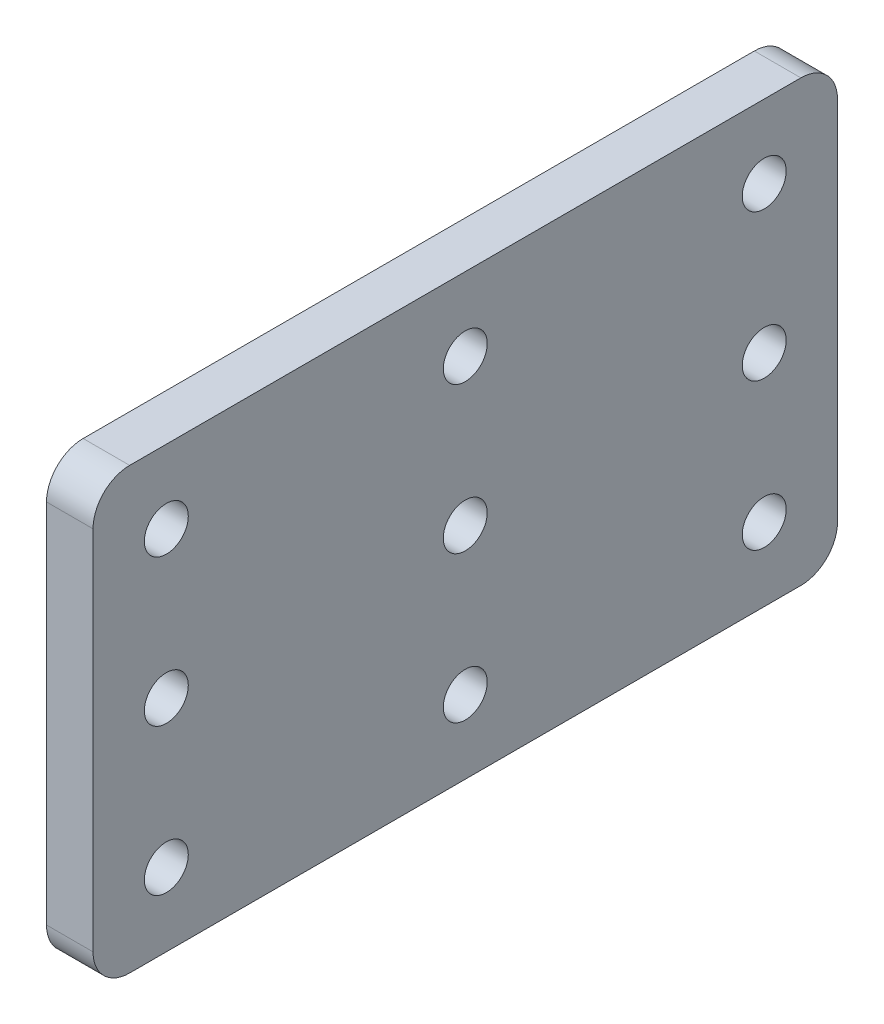
ISO-10303-21;
HEADER;
FILE_DESCRIPTION(('STEP AP214'),'2;1');
FILE_NAME('part.step','',(''),(''),'','','');
FILE_SCHEMA(('AUTOMOTIVE_DESIGN { 1 0 10303 214 1 1 1 1 }'));
ENDSEC;
DATA;
#1=APPLICATION_CONTEXT('core data for automotive mechanical design processes');
#2=APPLICATION_PROTOCOL_DEFINITION('international standard','automotive_design',2000,#1);
#3=PRODUCT_CONTEXT('',#1,'mechanical');
#4=PRODUCT('Part','Part','',(#3));
#5=PRODUCT_RELATED_PRODUCT_CATEGORY('part','',(#4));
#6=PRODUCT_DEFINITION_FORMATION('','',#4);
#7=PRODUCT_DEFINITION_CONTEXT('part definition',#1,'design');
#8=PRODUCT_DEFINITION('design','',#6,#7);
#9=PRODUCT_DEFINITION_SHAPE('','',#8);
#10=(LENGTH_UNIT() NAMED_UNIT(*) SI_UNIT(.MILLI.,.METRE.));
#11=(NAMED_UNIT(*) PLANE_ANGLE_UNIT() SI_UNIT($,.RADIAN.));
#12=(NAMED_UNIT(*) SI_UNIT($,.STERADIAN.) SOLID_ANGLE_UNIT());
#13=UNCERTAINTY_MEASURE_WITH_UNIT(LENGTH_MEASURE(1.E-05),#10,'distance_accuracy_value','');
#14=(GEOMETRIC_REPRESENTATION_CONTEXT(3) GLOBAL_UNCERTAINTY_ASSIGNED_CONTEXT((#13)) GLOBAL_UNIT_ASSIGNED_CONTEXT((#10,
#11,#12)) REPRESENTATION_CONTEXT('',''));
#15=CARTESIAN_POINT('',(0.,0.,0.));
#16=DIRECTION('',(0.,0.,1.));
#17=DIRECTION('',(1.,0.,0.));
#18=AXIS2_PLACEMENT_3D('',#15,#16,#17);
#19=CARTESIAN_POINT('',(80.0082513650366,30.,101.6));
#20=DIRECTION('',(1.,0.,0.));
#21=DIRECTION('',(0.,0.,-1.));
#22=AXIS2_PLACEMENT_3D('',#19,#20,#21);
#23=PLANE('',#22);
#24=CARTESIAN_POINT('',(80.0082513650366,20.,91.6));
#25=DIRECTION('',(1.,0.,0.));
#26=DIRECTION('',(0.,0.,-1.));
#27=AXIS2_PLACEMENT_3D('',#24,#25,#26);
#28=CIRCLE('',#27,2.99999999999998);
#29=CARTESIAN_POINT('',(80.0082513650366,20.,88.6));
#30=VERTEX_POINT('',#29);
#31=EDGE_CURVE('E420',#30,#30,#28,.T.);
#32=ORIENTED_EDGE('',*,*,#31,.T.);
#33=EDGE_LOOP('',(#32));
#34=FACE_BOUND('',#33,.T.);
#35=CARTESIAN_POINT('',(80.0082513650366,0.,91.6));
#36=DIRECTION('',(1.,0.,0.));
#37=DIRECTION('',(0.,0.,-1.));
#38=AXIS2_PLACEMENT_3D('',#35,#36,#37);
#39=CIRCLE('',#38,2.99999999999998);
#40=CARTESIAN_POINT('',(80.0082513650366,0.,88.6));
#41=VERTEX_POINT('',#40);
#42=EDGE_CURVE('E416',#41,#41,#39,.T.);
#43=ORIENTED_EDGE('',*,*,#42,.T.);
#44=EDGE_LOOP('',(#43));
#45=FACE_BOUND('',#44,.T.);
#46=CARTESIAN_POINT('',(80.0082513650366,-20.,91.6));
#47=DIRECTION('',(1.,0.,0.));
#48=DIRECTION('',(0.,0.,-1.));
#49=AXIS2_PLACEMENT_3D('',#46,#47,#48);
#50=CIRCLE('',#49,2.99999999999998);
#51=CARTESIAN_POINT('',(80.0082513650366,-20.,88.6));
#52=VERTEX_POINT('',#51);
#53=EDGE_CURVE('E412',#52,#52,#50,.T.);
#54=ORIENTED_EDGE('',*,*,#53,.T.);
#55=EDGE_LOOP('',(#54));
#56=FACE_BOUND('',#55,.T.);
#57=CARTESIAN_POINT('',(80.0082513650366,-20.,50.8));
#58=DIRECTION('',(1.,0.,0.));
#59=DIRECTION('',(0.,0.,-1.));
#60=AXIS2_PLACEMENT_3D('',#57,#58,#59);
#61=CIRCLE('',#60,3.00000000000001);
#62=CARTESIAN_POINT('',(80.0082513650366,-20.,47.8));
#63=VERTEX_POINT('',#62);
#64=EDGE_CURVE('E408',#63,#63,#61,.T.);
#65=ORIENTED_EDGE('',*,*,#64,.T.);
#66=EDGE_LOOP('',(#65));
#67=FACE_BOUND('',#66,.T.);
#68=CARTESIAN_POINT('',(80.0082513650366,0.,50.8));
#69=DIRECTION('',(1.,0.,0.));
#70=DIRECTION('',(0.,0.,-1.));
#71=AXIS2_PLACEMENT_3D('',#68,#69,#70);
#72=CIRCLE('',#71,3.00000000000001);
#73=CARTESIAN_POINT('',(80.0082513650366,0.,47.8));
#74=VERTEX_POINT('',#73);
#75=EDGE_CURVE('E404',#74,#74,#72,.T.);
#76=ORIENTED_EDGE('',*,*,#75,.T.);
#77=EDGE_LOOP('',(#76));
#78=FACE_BOUND('',#77,.T.);
#79=CARTESIAN_POINT('',(80.0082513650366,20.,50.8));
#80=DIRECTION('',(1.,0.,0.));
#81=DIRECTION('',(0.,0.,-1.));
#82=AXIS2_PLACEMENT_3D('',#79,#80,#81);
#83=CIRCLE('',#82,3.00000000000001);
#84=CARTESIAN_POINT('',(80.0082513650366,20.,47.8));
#85=VERTEX_POINT('',#84);
#86=EDGE_CURVE('E400',#85,#85,#83,.T.);
#87=ORIENTED_EDGE('',*,*,#86,.T.);
#88=EDGE_LOOP('',(#87));
#89=FACE_BOUND('',#88,.T.);
#90=CARTESIAN_POINT('',(80.0082513650366,0.,10.));
#91=DIRECTION('',(1.,0.,0.));
#92=DIRECTION('',(0.,0.,-1.));
#93=AXIS2_PLACEMENT_3D('',#90,#91,#92);
#94=CIRCLE('',#93,3.);
#95=CARTESIAN_POINT('',(80.0082513650366,0.,7.));
#96=VERTEX_POINT('',#95);
#97=EDGE_CURVE('E396',#96,#96,#94,.T.);
#98=ORIENTED_EDGE('',*,*,#97,.T.);
#99=EDGE_LOOP('',(#98));
#100=FACE_BOUND('',#99,.T.);
#101=CARTESIAN_POINT('',(80.0082513650366,20.,10.));
#102=DIRECTION('',(1.,0.,0.));
#103=DIRECTION('',(0.,0.,-1.));
#104=AXIS2_PLACEMENT_3D('',#101,#102,#103);
#105=CIRCLE('',#104,3.);
#106=CARTESIAN_POINT('',(80.0082513650366,20.,7.));
#107=VERTEX_POINT('',#106);
#108=EDGE_CURVE('E390',#107,#107,#105,.T.);
#109=ORIENTED_EDGE('',*,*,#108,.T.);
#110=EDGE_LOOP('',(#109));
#111=FACE_BOUND('',#110,.T.);
#112=CARTESIAN_POINT('',(80.0082513650366,-20.,10.));
#113=DIRECTION('',(1.,0.,0.));
#114=DIRECTION('',(0.,0.,-1.));
#115=AXIS2_PLACEMENT_3D('',#112,#113,#114);
#116=CIRCLE('',#115,3.);
#117=CARTESIAN_POINT('',(80.0082513650366,-20.,7.));
#118=VERTEX_POINT('',#117);
#119=EDGE_CURVE('E163',#118,#118,#116,.T.);
#120=ORIENTED_EDGE('',*,*,#119,.T.);
#121=EDGE_LOOP('',(#120));
#122=FACE_BOUND('',#121,.T.);
#123=DIRECTION('',(0.,-1.,0.));
#124=VECTOR('',#123,1.);
#125=CARTESIAN_POINT('',(80.0082513650366,30.,0.));
#126=LINE('',#125,#124);
#127=CARTESIAN_POINT('',(80.0082513650366,25.,0.));
#128=VERTEX_POINT('',#127);
#129=CARTESIAN_POINT('',(80.0082513650366,-25.,0.));
#130=VERTEX_POINT('',#129);
#131=EDGE_CURVE('E160',#128,#130,#126,.T.);
#132=ORIENTED_EDGE('',*,*,#131,.T.);
#133=CARTESIAN_POINT('',(80.0082513650366,-25.,5.));
#134=DIRECTION('',(1.,0.,0.));
#135=DIRECTION('',(0.,0.,-1.));
#136=AXIS2_PLACEMENT_3D('',#133,#134,#135);
#137=CIRCLE('',#136,5.);
#138=CARTESIAN_POINT('',(80.0082513650366,-30.,5.));
#139=VERTEX_POINT('',#138);
#140=EDGE_CURVE('E141',#130,#139,#137,.F.);
#141=ORIENTED_EDGE('',*,*,#140,.T.);
#142=DIRECTION('',(0.,0.,-1.));
#143=VECTOR('',#142,1.);
#144=CARTESIAN_POINT('',(80.0082513650366,-30.,101.6));
#145=LINE('',#144,#143);
#146=CARTESIAN_POINT('',(80.0082513650366,-30.,96.6));
#147=VERTEX_POINT('',#146);
#148=EDGE_CURVE('E120',#147,#139,#145,.T.);
#149=ORIENTED_EDGE('',*,*,#148,.F.);
#150=CARTESIAN_POINT('',(80.0082513650366,-25.,96.6));
#151=DIRECTION('',(1.,0.,0.));
#152=DIRECTION('',(0.,0.,-1.));
#153=AXIS2_PLACEMENT_3D('',#150,#151,#152);
#154=CIRCLE('',#153,5.);
#155=CARTESIAN_POINT('',(80.0082513650366,-25.,101.6));
#156=VERTEX_POINT('',#155);
#157=EDGE_CURVE('E125',#147,#156,#154,.F.);
#158=ORIENTED_EDGE('',*,*,#157,.T.);
#159=DIRECTION('',(0.,-1.,0.));
#160=VECTOR('',#159,1.);
#161=CARTESIAN_POINT('',(80.0082513650366,30.,101.6));
#162=LINE('',#161,#160);
#163=CARTESIAN_POINT('',(80.0082513650366,25.,101.6));
#164=VERTEX_POINT('',#163);
#165=EDGE_CURVE('E151',#164,#156,#162,.T.);
#166=ORIENTED_EDGE('',*,*,#165,.F.);
#167=CARTESIAN_POINT('',(80.0082513650366,25.,96.6));
#168=DIRECTION('',(1.,0.,0.));
#169=DIRECTION('',(0.,0.,-1.));
#170=AXIS2_PLACEMENT_3D('',#167,#168,#169);
#171=CIRCLE('',#170,5.);
#172=CARTESIAN_POINT('',(80.0082513650366,30.,96.6));
#173=VERTEX_POINT('',#172);
#174=EDGE_CURVE('E56',#164,#173,#171,.F.);
#175=ORIENTED_EDGE('',*,*,#174,.T.);
#176=DIRECTION('',(0.,0.,-1.));
#177=VECTOR('',#176,1.);
#178=CARTESIAN_POINT('',(80.0082513650366,30.,101.6));
#179=LINE('',#178,#177);
#180=CARTESIAN_POINT('',(80.0082513650366,30.,5.));
#181=VERTEX_POINT('',#180);
#182=EDGE_CURVE('E157',#173,#181,#179,.T.);
#183=ORIENTED_EDGE('',*,*,#182,.T.);
#184=CARTESIAN_POINT('',(80.0082513650366,25.,5.));
#185=DIRECTION('',(1.,0.,0.));
#186=DIRECTION('',(0.,0.,-1.));
#187=AXIS2_PLACEMENT_3D('',#184,#185,#186);
#188=CIRCLE('',#187,5.);
#189=EDGE_CURVE('E48',#181,#128,#188,.F.);
#190=ORIENTED_EDGE('',*,*,#189,.T.);
#191=EDGE_LOOP('',(#132,#141,#149,#158,#166,#175,#183,#190));
#192=FACE_BOUND('',#191,.T.);
#193=ADVANCED_FACE('F33',(#34,#45,#56,#67,#78,#89,#100,#111,#122,#192),#23,.F.);
#194=CARTESIAN_POINT('',(80.0082513650366,-30.,101.6));
#195=DIRECTION('',(0.,1.,0.));
#196=DIRECTION('',(0.,0.,1.));
#197=AXIS2_PLACEMENT_3D('',#194,#195,#196);
#198=PLANE('',#197);
#199=ORIENTED_EDGE('',*,*,#148,.T.);
#200=DIRECTION('',(1.,0.,0.));
#201=VECTOR('',#200,1.);
#202=CARTESIAN_POINT('',(80.0082513650366,-30.,5.));
#203=LINE('',#202,#201);
#204=CARTESIAN_POINT('',(86.3582513650366,-30.,5.));
#205=VERTEX_POINT('',#204);
#206=EDGE_CURVE('E119',#139,#205,#203,.T.);
#207=ORIENTED_EDGE('',*,*,#206,.T.);
#208=DIRECTION('',(0.,0.,-1.));
#209=VECTOR('',#208,1.);
#210=CARTESIAN_POINT('',(86.3582513650366,-30.,101.6));
#211=LINE('',#210,#209);
#212=CARTESIAN_POINT('',(86.3582513650366,-30.,96.6));
#213=VERTEX_POINT('',#212);
#214=EDGE_CURVE('E103',#213,#205,#211,.T.);
#215=ORIENTED_EDGE('',*,*,#214,.F.);
#216=DIRECTION('',(1.,0.,0.));
#217=VECTOR('',#216,1.);
#218=CARTESIAN_POINT('',(80.0082513650366,-30.,96.6));
#219=LINE('',#218,#217);
#220=EDGE_CURVE('E116',#213,#147,#219,.F.);
#221=ORIENTED_EDGE('',*,*,#220,.T.);
#222=EDGE_LOOP('',(#199,#207,#215,#221));
#223=FACE_BOUND('',#222,.T.);
#224=ADVANCED_FACE('F115',(#223),#198,.F.);
#225=CARTESIAN_POINT('',(86.3582513650366,30.,101.6));
#226=DIRECTION('',(-1.,0.,0.));
#227=DIRECTION('',(0.,0.,1.));
#228=AXIS2_PLACEMENT_3D('',#225,#226,#227);
#229=PLANE('',#228);
#230=CARTESIAN_POINT('',(86.3582513650366,20.,91.6));
#231=DIRECTION('',(1.,0.,0.));
#232=DIRECTION('',(0.,0.,1.));
#233=AXIS2_PLACEMENT_3D('',#230,#231,#232);
#234=CIRCLE('',#233,2.99999999999998);
#235=CARTESIAN_POINT('',(86.3582513650366,20.,94.6));
#236=VERTEX_POINT('',#235);
#237=EDGE_CURVE('E358',#236,#236,#234,.T.);
#238=ORIENTED_EDGE('',*,*,#237,.F.);
#239=EDGE_LOOP('',(#238));
#240=FACE_BOUND('',#239,.T.);
#241=CARTESIAN_POINT('',(86.3582513650366,0.,91.6));
#242=DIRECTION('',(1.,0.,0.));
#243=DIRECTION('',(0.,0.,1.));
#244=AXIS2_PLACEMENT_3D('',#241,#242,#243);
#245=CIRCLE('',#244,2.99999999999998);
#246=CARTESIAN_POINT('',(86.3582513650366,0.,94.6));
#247=VERTEX_POINT('',#246);
#248=EDGE_CURVE('E362',#247,#247,#245,.T.);
#249=ORIENTED_EDGE('',*,*,#248,.F.);
#250=EDGE_LOOP('',(#249));
#251=FACE_BOUND('',#250,.T.);
#252=CARTESIAN_POINT('',(86.3582513650366,-20.,91.6));
#253=DIRECTION('',(1.,0.,0.));
#254=DIRECTION('',(0.,0.,1.));
#255=AXIS2_PLACEMENT_3D('',#252,#253,#254);
#256=CIRCLE('',#255,2.99999999999998);
#257=CARTESIAN_POINT('',(86.3582513650366,-20.,94.6));
#258=VERTEX_POINT('',#257);
#259=EDGE_CURVE('E366',#258,#258,#256,.T.);
#260=ORIENTED_EDGE('',*,*,#259,.F.);
#261=EDGE_LOOP('',(#260));
#262=FACE_BOUND('',#261,.T.);
#263=CARTESIAN_POINT('',(86.3582513650366,-20.,50.8));
#264=DIRECTION('',(1.,0.,0.));
#265=DIRECTION('',(0.,0.,-1.));
#266=AXIS2_PLACEMENT_3D('',#263,#264,#265);
#267=CIRCLE('',#266,3.00000000000001);
#268=CARTESIAN_POINT('',(86.3582513650366,-20.,47.8));
#269=VERTEX_POINT('',#268);
#270=EDGE_CURVE('E370',#269,#269,#267,.T.);
#271=ORIENTED_EDGE('',*,*,#270,.F.);
#272=EDGE_LOOP('',(#271));
#273=FACE_BOUND('',#272,.T.);
#274=CARTESIAN_POINT('',(86.3582513650366,0.,50.8));
#275=DIRECTION('',(1.,0.,0.));
#276=DIRECTION('',(0.,0.,-1.));
#277=AXIS2_PLACEMENT_3D('',#274,#275,#276);
#278=CIRCLE('',#277,3.00000000000001);
#279=CARTESIAN_POINT('',(86.3582513650366,0.,47.8));
#280=VERTEX_POINT('',#279);
#281=EDGE_CURVE('E374',#280,#280,#278,.T.);
#282=ORIENTED_EDGE('',*,*,#281,.F.);
#283=EDGE_LOOP('',(#282));
#284=FACE_BOUND('',#283,.T.);
#285=CARTESIAN_POINT('',(86.3582513650366,20.,50.8));
#286=DIRECTION('',(1.,0.,0.));
#287=DIRECTION('',(0.,0.,-1.));
#288=AXIS2_PLACEMENT_3D('',#285,#286,#287);
#289=CIRCLE('',#288,3.00000000000001);
#290=CARTESIAN_POINT('',(86.3582513650366,20.,47.8));
#291=VERTEX_POINT('',#290);
#292=EDGE_CURVE('E378',#291,#291,#289,.T.);
#293=ORIENTED_EDGE('',*,*,#292,.F.);
#294=EDGE_LOOP('',(#293));
#295=FACE_BOUND('',#294,.T.);
#296=CARTESIAN_POINT('',(86.3582513650366,0.,10.));
#297=DIRECTION('',(1.,0.,0.));
#298=DIRECTION('',(0.,0.,-1.));
#299=AXIS2_PLACEMENT_3D('',#296,#297,#298);
#300=CIRCLE('',#299,3.);
#301=CARTESIAN_POINT('',(86.3582513650366,0.,7.));
#302=VERTEX_POINT('',#301);
#303=EDGE_CURVE('E382',#302,#302,#300,.T.);
#304=ORIENTED_EDGE('',*,*,#303,.F.);
#305=EDGE_LOOP('',(#304));
#306=FACE_BOUND('',#305,.T.);
#307=CARTESIAN_POINT('',(86.3582513650366,20.,10.));
#308=DIRECTION('',(1.,0.,0.));
#309=DIRECTION('',(0.,0.,-1.));
#310=AXIS2_PLACEMENT_3D('',#307,#308,#309);
#311=CIRCLE('',#310,3.);
#312=CARTESIAN_POINT('',(86.3582513650366,20.,7.));
#313=VERTEX_POINT('',#312);
#314=EDGE_CURVE('E386',#313,#313,#311,.T.);
#315=ORIENTED_EDGE('',*,*,#314,.F.);
#316=EDGE_LOOP('',(#315));
#317=FACE_BOUND('',#316,.T.);
#318=CARTESIAN_POINT('',(86.3582513650366,-20.,10.));
#319=DIRECTION('',(1.,0.,0.));
#320=DIRECTION('',(0.,0.,-1.));
#321=AXIS2_PLACEMENT_3D('',#318,#319,#320);
#322=CIRCLE('',#321,3.);
#323=CARTESIAN_POINT('',(86.3582513650366,-20.,7.));
#324=VERTEX_POINT('',#323);
#325=EDGE_CURVE('E389',#324,#324,#322,.T.);
#326=ORIENTED_EDGE('',*,*,#325,.F.);
#327=EDGE_LOOP('',(#326));
#328=FACE_BOUND('',#327,.T.);
#329=ORIENTED_EDGE('',*,*,#214,.T.);
#330=CARTESIAN_POINT('',(86.3582513650366,-25.,5.));
#331=DIRECTION('',(-1.,0.,0.));
#332=DIRECTION('',(0.,0.,1.));
#333=AXIS2_PLACEMENT_3D('',#330,#331,#332);
#334=CIRCLE('',#333,5.);
#335=CARTESIAN_POINT('',(86.3582513650366,-25.,0.));
#336=VERTEX_POINT('',#335);
#337=EDGE_CURVE('E132',#205,#336,#334,.F.);
#338=ORIENTED_EDGE('',*,*,#337,.T.);
#339=DIRECTION('',(0.,1.,0.));
#340=VECTOR('',#339,1.);
#341=CARTESIAN_POINT('',(86.3582513650366,30.,0.));
#342=LINE('',#341,#340);
#343=CARTESIAN_POINT('',(86.3582513650366,25.,0.));
#344=VERTEX_POINT('',#343);
#345=EDGE_CURVE('E155',#336,#344,#342,.T.);
#346=ORIENTED_EDGE('',*,*,#345,.T.);
#347=CARTESIAN_POINT('',(86.3582513650366,25.,5.));
#348=DIRECTION('',(-1.,0.,0.));
#349=DIRECTION('',(0.,0.,1.));
#350=AXIS2_PLACEMENT_3D('',#347,#348,#349);
#351=CIRCLE('',#350,5.);
#352=CARTESIAN_POINT('',(86.3582513650366,30.,5.));
#353=VERTEX_POINT('',#352);
#354=EDGE_CURVE('E109',#344,#353,#351,.F.);
#355=ORIENTED_EDGE('',*,*,#354,.T.);
#356=DIRECTION('',(0.,0.,-1.));
#357=VECTOR('',#356,1.);
#358=CARTESIAN_POINT('',(86.3582513650366,30.,101.6));
#359=LINE('',#358,#357);
#360=CARTESIAN_POINT('',(86.3582513650366,30.,96.6));
#361=VERTEX_POINT('',#360);
#362=EDGE_CURVE('E121',#361,#353,#359,.T.);
#363=ORIENTED_EDGE('',*,*,#362,.F.);
#364=CARTESIAN_POINT('',(86.3582513650366,25.,96.6));
#365=DIRECTION('',(-1.,0.,0.));
#366=DIRECTION('',(0.,0.,1.));
#367=AXIS2_PLACEMENT_3D('',#364,#365,#366);
#368=CIRCLE('',#367,5.);
#369=CARTESIAN_POINT('',(86.3582513650366,25.,101.6));
#370=VERTEX_POINT('',#369);
#371=EDGE_CURVE('E110',#361,#370,#368,.F.);
#372=ORIENTED_EDGE('',*,*,#371,.T.);
#373=DIRECTION('',(0.,1.,0.));
#374=VECTOR('',#373,1.);
#375=CARTESIAN_POINT('',(86.3582513650366,30.,101.6));
#376=LINE('',#375,#374);
#377=CARTESIAN_POINT('',(86.3582513650366,-25.,101.6));
#378=VERTEX_POINT('',#377);
#379=EDGE_CURVE('E105',#378,#370,#376,.T.);
#380=ORIENTED_EDGE('',*,*,#379,.F.);
#381=CARTESIAN_POINT('',(86.3582513650366,-25.,96.6));
#382=DIRECTION('',(-1.,0.,0.));
#383=DIRECTION('',(0.,0.,1.));
#384=AXIS2_PLACEMENT_3D('',#381,#382,#383);
#385=CIRCLE('',#384,5.);
#386=EDGE_CURVE('E100',#378,#213,#385,.F.);
#387=ORIENTED_EDGE('',*,*,#386,.T.);
#388=EDGE_LOOP('',(#329,#338,#346,#355,#363,#372,#380,#387));
#389=FACE_BOUND('',#388,.T.);
#390=ADVANCED_FACE('F102',(#240,#251,#262,#273,#284,#295,#306,#317,#328,#389),#229,.F.);
#391=CARTESIAN_POINT('',(80.0082513650366,30.,101.6));
#392=DIRECTION('',(0.,-1.,0.));
#393=DIRECTION('',(0.,0.,-1.));
#394=AXIS2_PLACEMENT_3D('',#391,#392,#393);
#395=PLANE('',#394);
#396=ORIENTED_EDGE('',*,*,#362,.T.);
#397=DIRECTION('',(-1.,0.,0.));
#398=VECTOR('',#397,1.);
#399=CARTESIAN_POINT('',(80.0082513650366,30.,5.));
#400=LINE('',#399,#398);
#401=EDGE_CURVE('E145',#353,#181,#400,.T.);
#402=ORIENTED_EDGE('',*,*,#401,.T.);
#403=ORIENTED_EDGE('',*,*,#182,.F.);
#404=DIRECTION('',(-1.,0.,0.));
#405=VECTOR('',#404,1.);
#406=CARTESIAN_POINT('',(86.3582513650366,30.,96.6));
#407=LINE('',#406,#405);
#408=EDGE_CURVE('E143',#173,#361,#407,.F.);
#409=ORIENTED_EDGE('',*,*,#408,.T.);
#410=EDGE_LOOP('',(#396,#402,#403,#409));
#411=FACE_BOUND('',#410,.T.);
#412=ADVANCED_FACE('F171',(#411),#395,.F.);
#413=CARTESIAN_POINT('',(0.,0.,101.6));
#414=DIRECTION('',(0.,0.,1.));
#415=DIRECTION('',(1.,0.,0.));
#416=AXIS2_PLACEMENT_3D('',#413,#414,#415);
#417=PLANE('',#416);
#418=ORIENTED_EDGE('',*,*,#165,.T.);
#419=DIRECTION('',(1.,0.,0.));
#420=VECTOR('',#419,1.);
#421=CARTESIAN_POINT('',(86.3582513650366,-25.,101.6));
#422=LINE('',#421,#420);
#423=EDGE_CURVE('E11',#156,#378,#422,.T.);
#424=ORIENTED_EDGE('',*,*,#423,.T.);
#425=ORIENTED_EDGE('',*,*,#379,.T.);
#426=DIRECTION('',(-1.,0.,0.));
#427=VECTOR('',#426,1.);
#428=CARTESIAN_POINT('',(80.0082513650366,25.,101.6));
#429=LINE('',#428,#427);
#430=EDGE_CURVE('E41',#370,#164,#429,.T.);
#431=ORIENTED_EDGE('',*,*,#430,.T.);
#432=EDGE_LOOP('',(#418,#424,#425,#431));
#433=FACE_BOUND('',#432,.T.);
#434=ADVANCED_FACE('F150',(#433),#417,.T.);
#435=CARTESIAN_POINT('',(0.,0.,0.));
#436=DIRECTION('',(0.,0.,1.));
#437=DIRECTION('',(1.,0.,0.));
#438=AXIS2_PLACEMENT_3D('',#435,#436,#437);
#439=PLANE('',#438);
#440=ORIENTED_EDGE('',*,*,#345,.F.);
#441=DIRECTION('',(1.,0.,0.));
#442=VECTOR('',#441,1.);
#443=CARTESIAN_POINT('',(0.,-25.,0.));
#444=LINE('',#443,#442);
#445=EDGE_CURVE('E136',#336,#130,#444,.F.);
#446=ORIENTED_EDGE('',*,*,#445,.T.);
#447=ORIENTED_EDGE('',*,*,#131,.F.);
#448=DIRECTION('',(-1.,0.,0.));
#449=VECTOR('',#448,1.);
#450=CARTESIAN_POINT('',(0.,25.,0.));
#451=LINE('',#450,#449);
#452=EDGE_CURVE('E134',#128,#344,#451,.F.);
#453=ORIENTED_EDGE('',*,*,#452,.T.);
#454=EDGE_LOOP('',(#440,#446,#447,#453));
#455=FACE_BOUND('',#454,.T.);
#456=ADVANCED_FACE('F178',(#455),#439,.F.);
#457=CARTESIAN_POINT('',(76.3582513650366,-20.,10.));
#458=DIRECTION('',(1.,0.,0.));
#459=DIRECTION('',(0.,0.,-1.));
#460=AXIS2_PLACEMENT_3D('',#457,#458,#459);
#461=CYLINDRICAL_SURFACE('',#460,3.);
#462=ORIENTED_EDGE('',*,*,#325,.T.);
#463=EDGE_LOOP('',(#462));
#464=FACE_BOUND('',#463,.T.);
#465=ORIENTED_EDGE('',*,*,#119,.F.);
#466=EDGE_LOOP('',(#465));
#467=FACE_BOUND('',#466,.T.);
#468=ADVANCED_FACE('F294',(#464,#467),#461,.F.);
#469=CARTESIAN_POINT('',(76.3582513650366,20.,10.));
#470=DIRECTION('',(1.,0.,0.));
#471=DIRECTION('',(0.,0.,-1.));
#472=AXIS2_PLACEMENT_3D('',#469,#470,#471);
#473=CYLINDRICAL_SURFACE('',#472,3.);
#474=ORIENTED_EDGE('',*,*,#314,.T.);
#475=EDGE_LOOP('',(#474));
#476=FACE_BOUND('',#475,.T.);
#477=ORIENTED_EDGE('',*,*,#108,.F.);
#478=EDGE_LOOP('',(#477));
#479=FACE_BOUND('',#478,.T.);
#480=ADVANCED_FACE('F285',(#476,#479),#473,.F.);
#481=CARTESIAN_POINT('',(76.3582513650366,0.,10.));
#482=DIRECTION('',(1.,0.,0.));
#483=DIRECTION('',(0.,0.,-1.));
#484=AXIS2_PLACEMENT_3D('',#481,#482,#483);
#485=CYLINDRICAL_SURFACE('',#484,3.);
#486=ORIENTED_EDGE('',*,*,#303,.T.);
#487=EDGE_LOOP('',(#486));
#488=FACE_BOUND('',#487,.T.);
#489=ORIENTED_EDGE('',*,*,#97,.F.);
#490=EDGE_LOOP('',(#489));
#491=FACE_BOUND('',#490,.T.);
#492=ADVANCED_FACE('F276',(#488,#491),#485,.F.);
#493=CARTESIAN_POINT('',(76.3582513650366,20.,50.8));
#494=DIRECTION('',(1.,0.,0.));
#495=DIRECTION('',(0.,0.,-1.));
#496=AXIS2_PLACEMENT_3D('',#493,#494,#495);
#497=CYLINDRICAL_SURFACE('',#496,3.00000000000001);
#498=ORIENTED_EDGE('',*,*,#292,.T.);
#499=EDGE_LOOP('',(#498));
#500=FACE_BOUND('',#499,.T.);
#501=ORIENTED_EDGE('',*,*,#86,.F.);
#502=EDGE_LOOP('',(#501));
#503=FACE_BOUND('',#502,.T.);
#504=ADVANCED_FACE('F267',(#500,#503),#497,.F.);
#505=CARTESIAN_POINT('',(76.3582513650366,0.,50.8));
#506=DIRECTION('',(1.,0.,0.));
#507=DIRECTION('',(0.,0.,-1.));
#508=AXIS2_PLACEMENT_3D('',#505,#506,#507);
#509=CYLINDRICAL_SURFACE('',#508,3.00000000000001);
#510=ORIENTED_EDGE('',*,*,#281,.T.);
#511=EDGE_LOOP('',(#510));
#512=FACE_BOUND('',#511,.T.);
#513=ORIENTED_EDGE('',*,*,#75,.F.);
#514=EDGE_LOOP('',(#513));
#515=FACE_BOUND('',#514,.T.);
#516=ADVANCED_FACE('F258',(#512,#515),#509,.F.);
#517=CARTESIAN_POINT('',(76.3582513650366,-20.,50.8));
#518=DIRECTION('',(1.,0.,0.));
#519=DIRECTION('',(0.,0.,-1.));
#520=AXIS2_PLACEMENT_3D('',#517,#518,#519);
#521=CYLINDRICAL_SURFACE('',#520,3.00000000000001);
#522=ORIENTED_EDGE('',*,*,#270,.T.);
#523=EDGE_LOOP('',(#522));
#524=FACE_BOUND('',#523,.T.);
#525=ORIENTED_EDGE('',*,*,#64,.F.);
#526=EDGE_LOOP('',(#525));
#527=FACE_BOUND('',#526,.T.);
#528=ADVANCED_FACE('F249',(#524,#527),#521,.F.);
#529=CARTESIAN_POINT('',(76.3582513650366,-20.,91.6));
#530=DIRECTION('',(1.,0.,0.));
#531=DIRECTION('',(0.,0.,-1.));
#532=AXIS2_PLACEMENT_3D('',#529,#530,#531);
#533=CYLINDRICAL_SURFACE('',#532,2.99999999999998);
#534=ORIENTED_EDGE('',*,*,#259,.T.);
#535=EDGE_LOOP('',(#534));
#536=FACE_BOUND('',#535,.T.);
#537=ORIENTED_EDGE('',*,*,#53,.F.);
#538=EDGE_LOOP('',(#537));
#539=FACE_BOUND('',#538,.T.);
#540=ADVANCED_FACE('F240',(#536,#539),#533,.F.);
#541=CARTESIAN_POINT('',(76.3582513650366,0.,91.6));
#542=DIRECTION('',(1.,0.,0.));
#543=DIRECTION('',(0.,0.,-1.));
#544=AXIS2_PLACEMENT_3D('',#541,#542,#543);
#545=CYLINDRICAL_SURFACE('',#544,2.99999999999998);
#546=ORIENTED_EDGE('',*,*,#248,.T.);
#547=EDGE_LOOP('',(#546));
#548=FACE_BOUND('',#547,.T.);
#549=ORIENTED_EDGE('',*,*,#42,.F.);
#550=EDGE_LOOP('',(#549));
#551=FACE_BOUND('',#550,.T.);
#552=ADVANCED_FACE('F231',(#548,#551),#545,.F.);
#553=CARTESIAN_POINT('',(76.3582513650366,20.,91.6));
#554=DIRECTION('',(1.,0.,0.));
#555=DIRECTION('',(0.,0.,-1.));
#556=AXIS2_PLACEMENT_3D('',#553,#554,#555);
#557=CYLINDRICAL_SURFACE('',#556,2.99999999999998);
#558=ORIENTED_EDGE('',*,*,#237,.T.);
#559=EDGE_LOOP('',(#558));
#560=FACE_BOUND('',#559,.T.);
#561=ORIENTED_EDGE('',*,*,#31,.F.);
#562=EDGE_LOOP('',(#561));
#563=FACE_BOUND('',#562,.T.);
#564=ADVANCED_FACE('F200',(#560,#563),#557,.F.);
#565=CARTESIAN_POINT('',(80.0082513650366,-25.,5.));
#566=DIRECTION('',(1.,0.,0.));
#567=DIRECTION('',(0.,0.,-1.));
#568=AXIS2_PLACEMENT_3D('',#565,#566,#567);
#569=CYLINDRICAL_SURFACE('',#568,5.);
#570=ORIENTED_EDGE('',*,*,#140,.F.);
#571=ORIENTED_EDGE('',*,*,#445,.F.);
#572=ORIENTED_EDGE('',*,*,#337,.F.);
#573=ORIENTED_EDGE('',*,*,#206,.F.);
#574=EDGE_LOOP('',(#570,#571,#572,#573));
#575=FACE_BOUND('',#574,.T.);
#576=ADVANCED_FACE('F182',(#575),#569,.T.);
#577=CARTESIAN_POINT('',(80.0082513650366,25.,5.));
#578=DIRECTION('',(-1.,0.,0.));
#579=DIRECTION('',(0.,0.,1.));
#580=AXIS2_PLACEMENT_3D('',#577,#578,#579);
#581=CYLINDRICAL_SURFACE('',#580,5.);
#582=ORIENTED_EDGE('',*,*,#354,.F.);
#583=ORIENTED_EDGE('',*,*,#452,.F.);
#584=ORIENTED_EDGE('',*,*,#189,.F.);
#585=ORIENTED_EDGE('',*,*,#401,.F.);
#586=EDGE_LOOP('',(#582,#583,#584,#585));
#587=FACE_BOUND('',#586,.T.);
#588=ADVANCED_FACE('F174',(#587),#581,.T.);
#589=CARTESIAN_POINT('',(0.,-25.,96.6));
#590=DIRECTION('',(-1.,0.,0.));
#591=DIRECTION('',(0.,0.,1.));
#592=AXIS2_PLACEMENT_3D('',#589,#590,#591);
#593=CYLINDRICAL_SURFACE('',#592,5.);
#594=ORIENTED_EDGE('',*,*,#157,.F.);
#595=ORIENTED_EDGE('',*,*,#220,.F.);
#596=ORIENTED_EDGE('',*,*,#386,.F.);
#597=ORIENTED_EDGE('',*,*,#423,.F.);
#598=EDGE_LOOP('',(#594,#595,#596,#597));
#599=FACE_BOUND('',#598,.T.);
#600=ADVANCED_FACE('F124',(#599),#593,.T.);
#601=CARTESIAN_POINT('',(0.,25.,96.6));
#602=DIRECTION('',(1.,0.,0.));
#603=DIRECTION('',(0.,0.,-1.));
#604=AXIS2_PLACEMENT_3D('',#601,#602,#603);
#605=CYLINDRICAL_SURFACE('',#604,5.);
#606=ORIENTED_EDGE('',*,*,#371,.F.);
#607=ORIENTED_EDGE('',*,*,#408,.F.);
#608=ORIENTED_EDGE('',*,*,#174,.F.);
#609=ORIENTED_EDGE('',*,*,#430,.F.);
#610=EDGE_LOOP('',(#606,#607,#608,#609));
#611=FACE_BOUND('',#610,.T.);
#612=ADVANCED_FACE('F35',(#611),#605,.T.);
#613=CLOSED_SHELL('',(#193,#224,#390,#412,#434,#456,#468,#480,#492,#504,#516,#528,#540,#552,
#564,#576,#588,#600,#612));
#614=MANIFOLD_SOLID_BREP('B2',#613);
#615=ADVANCED_BREP_SHAPE_REPRESENTATION('',(#18,#614),#14);
#616=SHAPE_DEFINITION_REPRESENTATION(#9,#615);
ENDSEC;
END-ISO-10303-21;
